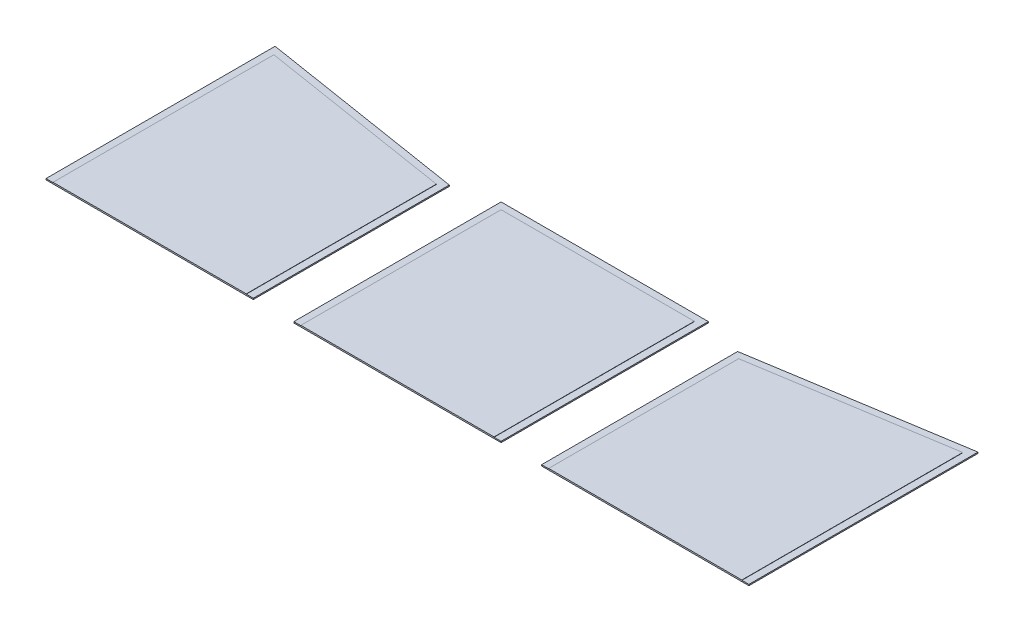
ISO-10303-21;
HEADER;
FILE_DESCRIPTION(('STEP AP214'),'2;1');
FILE_NAME('part.step','',(''),(''),'','','');
FILE_SCHEMA(('AUTOMOTIVE_DESIGN { 1 0 10303 214 1 1 1 1 }'));
ENDSEC;
DATA;
#1=APPLICATION_CONTEXT('core data for automotive mechanical design processes');
#2=APPLICATION_PROTOCOL_DEFINITION('international standard','automotive_design',2000,#1);
#3=PRODUCT_CONTEXT('',#1,'mechanical');
#4=PRODUCT('Part','Part','',(#3));
#5=PRODUCT_RELATED_PRODUCT_CATEGORY('part','',(#4));
#6=PRODUCT_DEFINITION_FORMATION('','',#4);
#7=PRODUCT_DEFINITION_CONTEXT('part definition',#1,'design');
#8=PRODUCT_DEFINITION('design','',#6,#7);
#9=PRODUCT_DEFINITION_SHAPE('','',#8);
#10=(LENGTH_UNIT() NAMED_UNIT(*) SI_UNIT(.MILLI.,.METRE.));
#11=(NAMED_UNIT(*) PLANE_ANGLE_UNIT() SI_UNIT($,.RADIAN.));
#12=(NAMED_UNIT(*) SI_UNIT($,.STERADIAN.) SOLID_ANGLE_UNIT());
#13=UNCERTAINTY_MEASURE_WITH_UNIT(LENGTH_MEASURE(1.E-05),#10,'distance_accuracy_value','');
#14=(GEOMETRIC_REPRESENTATION_CONTEXT(3) GLOBAL_UNCERTAINTY_ASSIGNED_CONTEXT((#13)) GLOBAL_UNIT_ASSIGNED_CONTEXT((#10,
#11,#12)) REPRESENTATION_CONTEXT('',''));
#15=CARTESIAN_POINT('',(0.,0.,0.));
#16=DIRECTION('',(0.,0.,1.));
#17=DIRECTION('',(1.,0.,0.));
#18=AXIS2_PLACEMENT_3D('',#15,#16,#17);
#19=CARTESIAN_POINT('',(0.,0.9,0.));
#20=DIRECTION('',(0.,-1.,0.));
#21=DIRECTION('',(0.,0.,-1.));
#22=AXIS2_PLACEMENT_3D('',#19,#20,#21);
#23=PLANE('',#22);
#24=DIRECTION('',(0.,0.,1.));
#25=VECTOR('',#24,1.);
#26=CARTESIAN_POINT('',(111.95,0.9,76.75));
#27=LINE('',#26,#25);
#28=CARTESIAN_POINT('',(111.95,0.9,-63.9635031038431));
#29=VERTEX_POINT('',#28);
#30=CARTESIAN_POINT('',(111.95,0.9,76.75));
#31=VERTEX_POINT('',#30);
#32=EDGE_CURVE('E73',#29,#31,#27,.T.);
#33=ORIENTED_EDGE('',*,*,#32,.F.);
#34=DIRECTION('',(-0.987506103130121,0.,0.157580761137785));
#35=VECTOR('',#34,1.);
#36=CARTESIAN_POINT('',(111.95,0.9,-63.9635031038431));
#37=LINE('',#36,#35);
#38=CARTESIAN_POINT('',(255.056022484842,0.9,-86.799570521637));
#39=VERTEX_POINT('',#38);
#40=EDGE_CURVE('E119',#39,#29,#37,.T.);
#41=ORIENTED_EDGE('',*,*,#40,.F.);
#42=DIRECTION('',(3.68236268928145E-05,0.,-0.99999999932201));
#43=VECTOR('',#42,1.);
#44=CARTESIAN_POINT('',(255.056022484842,0.9,-86.799570521637));
#45=LINE('',#44,#43);
#46=CARTESIAN_POINT('',(255.049999996474,0.9,76.75));
#47=VERTEX_POINT('',#46);
#48=EDGE_CURVE('E79',#47,#39,#45,.T.);
#49=ORIENTED_EDGE('',*,*,#48,.F.);
#50=DIRECTION('',(1.,0.,0.));
#51=VECTOR('',#50,1.);
#52=CARTESIAN_POINT('',(106.75,0.9,76.75));
#53=LINE('',#52,#51);
#54=CARTESIAN_POINT('',(260.25,0.9,76.75));
#55=VERTEX_POINT('',#54);
#56=EDGE_CURVE('E180',#47,#55,#53,.T.);
#57=ORIENTED_EDGE('',*,*,#56,.T.);
#58=DIRECTION('',(3.68236268927542E-05,0.,-0.99999999932201));
#59=VECTOR('',#58,1.);
#60=CARTESIAN_POINT('',(260.25,0.9,76.75));
#61=LINE('',#60,#59);
#62=CARTESIAN_POINT('',(260.256246950957,0.9,-92.8951838149399));
#63=VERTEX_POINT('',#62);
#64=EDGE_CURVE('E59',#55,#63,#61,.T.);
#65=ORIENTED_EDGE('',*,*,#64,.T.);
#66=DIRECTION('',(-0.98750610313012,0.,0.157580761137785));
#67=VECTOR('',#66,1.);
#68=CARTESIAN_POINT('',(260.256246950957,0.9,-92.8951838149399));
#69=LINE('',#68,#67);
#70=CARTESIAN_POINT('',(106.75,0.9,-68.39950611));
#71=VERTEX_POINT('',#70);
#72=EDGE_CURVE('E194',#63,#71,#69,.T.);
#73=ORIENTED_EDGE('',*,*,#72,.T.);
#74=DIRECTION('',(0.,0.,1.));
#75=VECTOR('',#74,1.);
#76=CARTESIAN_POINT('',(106.75,0.9,-68.39950611));
#77=LINE('',#76,#75);
#78=CARTESIAN_POINT('',(106.75,0.9,76.75));
#79=VERTEX_POINT('',#78);
#80=EDGE_CURVE('E192',#71,#79,#77,.T.);
#81=ORIENTED_EDGE('',*,*,#80,.T.);
#82=EDGE_CURVE('E189',#79,#31,#53,.T.);
#83=ORIENTED_EDGE('',*,*,#82,.T.);
#84=EDGE_LOOP('',(#33,#41,#49,#57,#65,#73,#81,#83));
#85=FACE_BOUND('',#84,.T.);
#86=ADVANCED_FACE('F56',(#85),#23,.F.);
#87=CARTESIAN_POINT('',(260.25,0.9,76.75));
#88=DIRECTION('',(-0.99999999932201,0.,-3.68236268927542E-05));
#89=DIRECTION('',(-3.68236268927542E-05,0.,0.99999999932201));
#90=AXIS2_PLACEMENT_3D('',#87,#88,#89);
#91=PLANE('',#90);
#92=DIRECTION('',(3.68236268927542E-05,0.,-0.99999999932201));
#93=VECTOR('',#92,1.);
#94=CARTESIAN_POINT('',(260.25,0.,76.75));
#95=LINE('',#94,#93);
#96=CARTESIAN_POINT('',(260.25,0.,76.75));
#97=VERTEX_POINT('',#96);
#98=CARTESIAN_POINT('',(260.256246950957,0.,-92.8951838149399));
#99=VERTEX_POINT('',#98);
#100=EDGE_CURVE('E12',#97,#99,#95,.T.);
#101=ORIENTED_EDGE('',*,*,#100,.T.);
#102=DIRECTION('',(0.,-1.,0.));
#103=VECTOR('',#102,1.);
#104=CARTESIAN_POINT('',(260.256246950957,0.9,-92.8951838149399));
#105=LINE('',#104,#103);
#106=EDGE_CURVE('E135',#63,#99,#105,.T.);
#107=ORIENTED_EDGE('',*,*,#106,.F.);
#108=ORIENTED_EDGE('',*,*,#64,.F.);
#109=DIRECTION('',(0.,-1.,0.));
#110=VECTOR('',#109,1.);
#111=CARTESIAN_POINT('',(260.25,0.9,76.75));
#112=LINE('',#111,#110);
#113=EDGE_CURVE('E176',#55,#97,#112,.T.);
#114=ORIENTED_EDGE('',*,*,#113,.T.);
#115=EDGE_LOOP('',(#101,#107,#108,#114));
#116=FACE_BOUND('',#115,.T.);
#117=ADVANCED_FACE('F203',(#116),#91,.F.);
#118=CARTESIAN_POINT('',(260.256246950957,0.9,-92.8951838149399));
#119=DIRECTION('',(0.157580761137785,0.,0.987506103130121));
#120=DIRECTION('',(0.987506103130121,0.,-0.157580761137785));
#121=AXIS2_PLACEMENT_3D('',#118,#119,#120);
#122=PLANE('',#121);
#123=DIRECTION('',(-0.98750610313012,0.,0.157580761137785));
#124=VECTOR('',#123,1.);
#125=CARTESIAN_POINT('',(260.256246950957,0.,-92.8951838149399));
#126=LINE('',#125,#124);
#127=CARTESIAN_POINT('',(106.75,0.,-68.39950611));
#128=VERTEX_POINT('',#127);
#129=EDGE_CURVE('E65',#99,#128,#126,.T.);
#130=ORIENTED_EDGE('',*,*,#129,.T.);
#131=DIRECTION('',(0.,-1.,0.));
#132=VECTOR('',#131,1.);
#133=CARTESIAN_POINT('',(106.75,0.9,-68.39950611));
#134=LINE('',#133,#132);
#135=EDGE_CURVE('E168',#71,#128,#134,.T.);
#136=ORIENTED_EDGE('',*,*,#135,.F.);
#137=ORIENTED_EDGE('',*,*,#72,.F.);
#138=ORIENTED_EDGE('',*,*,#106,.T.);
#139=EDGE_LOOP('',(#130,#136,#137,#138));
#140=FACE_BOUND('',#139,.T.);
#141=ADVANCED_FACE('F206',(#140),#122,.F.);
#142=CARTESIAN_POINT('',(106.75,0.9,-68.39950611));
#143=DIRECTION('',(1.,0.,0.));
#144=DIRECTION('',(0.,0.,-1.));
#145=AXIS2_PLACEMENT_3D('',#142,#143,#144);
#146=PLANE('',#145);
#147=DIRECTION('',(0.,0.,1.));
#148=VECTOR('',#147,1.);
#149=CARTESIAN_POINT('',(106.75,0.,-68.39950611));
#150=LINE('',#149,#148);
#151=CARTESIAN_POINT('',(106.75,0.,76.75));
#152=VERTEX_POINT('',#151);
#153=EDGE_CURVE('E184',#128,#152,#150,.T.);
#154=ORIENTED_EDGE('',*,*,#153,.T.);
#155=DIRECTION('',(0.,-1.,0.));
#156=VECTOR('',#155,1.);
#157=CARTESIAN_POINT('',(106.75,0.9,76.75));
#158=LINE('',#157,#156);
#159=EDGE_CURVE('E172',#79,#152,#158,.T.);
#160=ORIENTED_EDGE('',*,*,#159,.F.);
#161=ORIENTED_EDGE('',*,*,#80,.F.);
#162=ORIENTED_EDGE('',*,*,#135,.T.);
#163=EDGE_LOOP('',(#154,#160,#161,#162));
#164=FACE_BOUND('',#163,.T.);
#165=ADVANCED_FACE('F211',(#164),#146,.F.);
#166=CARTESIAN_POINT('',(106.75,0.9,76.75));
#167=DIRECTION('',(0.,0.,-1.));
#168=DIRECTION('',(-1.,0.,0.));
#169=AXIS2_PLACEMENT_3D('',#166,#167,#168);
#170=PLANE('',#169);
#171=DIRECTION('',(1.,0.,0.));
#172=VECTOR('',#171,1.);
#173=CARTESIAN_POINT('',(106.75,0.,76.75));
#174=LINE('',#173,#172);
#175=EDGE_CURVE('E181',#152,#97,#174,.T.);
#176=ORIENTED_EDGE('',*,*,#175,.T.);
#177=ORIENTED_EDGE('',*,*,#113,.F.);
#178=ORIENTED_EDGE('',*,*,#56,.F.);
#179=DIRECTION('',(0.,-1.,0.));
#180=VECTOR('',#179,1.);
#181=CARTESIAN_POINT('',(255.049999996474,1.1,76.75));
#182=LINE('',#181,#180);
#183=CARTESIAN_POINT('',(255.049999996474,1.1,76.75));
#184=VERTEX_POINT('',#183);
#185=EDGE_CURVE('E133',#184,#47,#182,.T.);
#186=ORIENTED_EDGE('',*,*,#185,.F.);
#187=DIRECTION('',(1.,0.,0.));
#188=VECTOR('',#187,1.);
#189=CARTESIAN_POINT('',(255.049999996474,1.1,76.75));
#190=LINE('',#189,#188);
#191=CARTESIAN_POINT('',(111.95,1.1,76.75));
#192=VERTEX_POINT('',#191);
#193=EDGE_CURVE('E153',#192,#184,#190,.T.);
#194=ORIENTED_EDGE('',*,*,#193,.F.);
#195=DIRECTION('',(0.,-1.,0.));
#196=VECTOR('',#195,1.);
#197=CARTESIAN_POINT('',(111.95,1.1,76.75));
#198=LINE('',#197,#196);
#199=EDGE_CURVE('E144',#192,#31,#198,.T.);
#200=ORIENTED_EDGE('',*,*,#199,.T.);
#201=ORIENTED_EDGE('',*,*,#82,.F.);
#202=ORIENTED_EDGE('',*,*,#159,.T.);
#203=EDGE_LOOP('',(#176,#177,#178,#186,#194,#200,#201,#202));
#204=FACE_BOUND('',#203,.T.);
#205=ADVANCED_FACE('F219',(#204),#170,.F.);
#206=CARTESIAN_POINT('',(0.,0.,0.));
#207=DIRECTION('',(0.,-1.,0.));
#208=DIRECTION('',(0.,0.,-1.));
#209=AXIS2_PLACEMENT_3D('',#206,#207,#208);
#210=PLANE('',#209);
#211=ORIENTED_EDGE('',*,*,#100,.F.);
#212=ORIENTED_EDGE('',*,*,#175,.F.);
#213=ORIENTED_EDGE('',*,*,#153,.F.);
#214=ORIENTED_EDGE('',*,*,#129,.F.);
#215=EDGE_LOOP('',(#211,#212,#213,#214));
#216=FACE_BOUND('',#215,.T.);
#217=ADVANCED_FACE('F242',(#216),#210,.T.);
#218=CARTESIAN_POINT('',(255.056022484842,1.1,-86.799570521637));
#219=DIRECTION('',(-0.99999999932201,0.,-3.68236268928145E-05));
#220=DIRECTION('',(-3.68236268928145E-05,0.,0.99999999932201));
#221=AXIS2_PLACEMENT_3D('',#218,#219,#220);
#222=PLANE('',#221);
#223=ORIENTED_EDGE('',*,*,#48,.T.);
#224=DIRECTION('',(0.,-1.,0.));
#225=VECTOR('',#224,1.);
#226=CARTESIAN_POINT('',(255.056022484842,1.1,-86.799570521637));
#227=LINE('',#226,#225);
#228=CARTESIAN_POINT('',(255.056022484842,1.1,-86.799570521637));
#229=VERTEX_POINT('',#228);
#230=EDGE_CURVE('E130',#229,#39,#227,.T.);
#231=ORIENTED_EDGE('',*,*,#230,.F.);
#232=DIRECTION('',(3.68236268928145E-05,0.,-0.99999999932201));
#233=VECTOR('',#232,1.);
#234=CARTESIAN_POINT('',(255.056022484842,1.1,-86.799570521637));
#235=LINE('',#234,#233);
#236=EDGE_CURVE('E159',#184,#229,#235,.T.);
#237=ORIENTED_EDGE('',*,*,#236,.F.);
#238=ORIENTED_EDGE('',*,*,#185,.T.);
#239=EDGE_LOOP('',(#223,#231,#237,#238));
#240=FACE_BOUND('',#239,.T.);
#241=ADVANCED_FACE('F129',(#240),#222,.F.);
#242=CARTESIAN_POINT('',(111.95,1.1,-63.9635031038431));
#243=DIRECTION('',(0.157580761137785,0.,0.987506103130121));
#244=DIRECTION('',(0.987506103130121,0.,-0.157580761137785));
#245=AXIS2_PLACEMENT_3D('',#242,#243,#244);
#246=PLANE('',#245);
#247=ORIENTED_EDGE('',*,*,#40,.T.);
#248=DIRECTION('',(0.,-1.,0.));
#249=VECTOR('',#248,1.);
#250=CARTESIAN_POINT('',(111.95,1.1,-63.9635031038431));
#251=LINE('',#250,#249);
#252=CARTESIAN_POINT('',(111.95,1.1,-63.9635031038431));
#253=VERTEX_POINT('',#252);
#254=EDGE_CURVE('E140',#253,#29,#251,.T.);
#255=ORIENTED_EDGE('',*,*,#254,.F.);
#256=DIRECTION('',(-0.987506103130121,0.,0.157580761137785));
#257=VECTOR('',#256,1.);
#258=CARTESIAN_POINT('',(111.95,1.1,-63.9635031038431));
#259=LINE('',#258,#257);
#260=EDGE_CURVE('E138',#229,#253,#259,.T.);
#261=ORIENTED_EDGE('',*,*,#260,.F.);
#262=ORIENTED_EDGE('',*,*,#230,.T.);
#263=EDGE_LOOP('',(#247,#255,#261,#262));
#264=FACE_BOUND('',#263,.T.);
#265=ADVANCED_FACE('F137',(#264),#246,.F.);
#266=CARTESIAN_POINT('',(111.95,1.1,76.75));
#267=DIRECTION('',(1.,0.,0.));
#268=DIRECTION('',(0.,0.,-1.));
#269=AXIS2_PLACEMENT_3D('',#266,#267,#268);
#270=PLANE('',#269);
#271=ORIENTED_EDGE('',*,*,#32,.T.);
#272=ORIENTED_EDGE('',*,*,#199,.F.);
#273=DIRECTION('',(0.,0.,1.));
#274=VECTOR('',#273,1.);
#275=CARTESIAN_POINT('',(111.95,1.1,76.75));
#276=LINE('',#275,#274);
#277=EDGE_CURVE('E151',#253,#192,#276,.T.);
#278=ORIENTED_EDGE('',*,*,#277,.F.);
#279=ORIENTED_EDGE('',*,*,#254,.T.);
#280=EDGE_LOOP('',(#271,#272,#278,#279));
#281=FACE_BOUND('',#280,.T.);
#282=ADVANCED_FACE('F216',(#281),#270,.F.);
#283=CARTESIAN_POINT('',(0.,1.1,0.));
#284=DIRECTION('',(0.,-1.,0.));
#285=DIRECTION('',(0.,0.,-1.));
#286=AXIS2_PLACEMENT_3D('',#283,#284,#285);
#287=PLANE('',#286);
#288=ORIENTED_EDGE('',*,*,#193,.T.);
#289=ORIENTED_EDGE('',*,*,#236,.T.);
#290=ORIENTED_EDGE('',*,*,#260,.T.);
#291=ORIENTED_EDGE('',*,*,#277,.T.);
#292=EDGE_LOOP('',(#288,#289,#290,#291));
#293=FACE_BOUND('',#292,.T.);
#294=ADVANCED_FACE('F221',(#293),#287,.F.);
#295=CLOSED_SHELL('',(#86,#117,#141,#165,#205,#217,#241,#265,#282,#294));
#296=MANIFOLD_SOLID_BREP('B2',#295);
#297=CARTESIAN_POINT('',(0.,0.9,0.));
#298=DIRECTION('',(0.,-1.,0.));
#299=DIRECTION('',(0.,0.,-1.));
#300=AXIS2_PLACEMENT_3D('',#297,#298,#299);
#301=PLANE('',#300);
#302=DIRECTION('',(3.68236268928146E-05,0.,0.99999999932201));
#303=VECTOR('',#302,1.);
#304=CARTESIAN_POINT('',(-255.056022484842,0.9,-86.7995705216369));
#305=LINE('',#304,#303);
#306=CARTESIAN_POINT('',(-255.056022484842,0.9,-86.7995705216369));
#307=VERTEX_POINT('',#306);
#308=CARTESIAN_POINT('',(-255.049999996474,0.9,76.75));
#309=VERTEX_POINT('',#308);
#310=EDGE_CURVE('E335',#307,#309,#305,.T.);
#311=ORIENTED_EDGE('',*,*,#310,.F.);
#312=DIRECTION('',(-0.987506103130121,0.,-0.157580761137785));
#313=VECTOR('',#312,1.);
#314=CARTESIAN_POINT('',(-111.95,0.9,-63.9635031038431));
#315=LINE('',#314,#313);
#316=CARTESIAN_POINT('',(-111.95,0.9,-63.9635031038431));
#317=VERTEX_POINT('',#316);
#318=EDGE_CURVE('E381',#317,#307,#315,.T.);
#319=ORIENTED_EDGE('',*,*,#318,.F.);
#320=DIRECTION('',(0.,0.,-1.));
#321=VECTOR('',#320,1.);
#322=CARTESIAN_POINT('',(-111.95,0.9,76.75));
#323=LINE('',#322,#321);
#324=CARTESIAN_POINT('',(-111.95,0.9,76.75));
#325=VERTEX_POINT('',#324);
#326=EDGE_CURVE('E341',#325,#317,#323,.T.);
#327=ORIENTED_EDGE('',*,*,#326,.F.);
#328=DIRECTION('',(1.,0.,0.));
#329=VECTOR('',#328,1.);
#330=CARTESIAN_POINT('',(-260.25,0.9,76.75));
#331=LINE('',#330,#329);
#332=CARTESIAN_POINT('',(-106.75,0.9,76.75));
#333=VERTEX_POINT('',#332);
#334=EDGE_CURVE('E434',#325,#333,#331,.T.);
#335=ORIENTED_EDGE('',*,*,#334,.T.);
#336=DIRECTION('',(0.,0.,-1.));
#337=VECTOR('',#336,1.);
#338=CARTESIAN_POINT('',(-106.75,0.9,76.75));
#339=LINE('',#338,#337);
#340=CARTESIAN_POINT('',(-106.75,0.9,-68.39950611));
#341=VERTEX_POINT('',#340);
#342=EDGE_CURVE('E427',#333,#341,#339,.T.);
#343=ORIENTED_EDGE('',*,*,#342,.T.);
#344=DIRECTION('',(-0.987506103130121,0.,-0.157580761137785));
#345=VECTOR('',#344,1.);
#346=CARTESIAN_POINT('',(-106.75,0.9,-68.39950611));
#347=LINE('',#346,#345);
#348=CARTESIAN_POINT('',(-260.256246950957,0.9,-92.8951838149399));
#349=VERTEX_POINT('',#348);
#350=EDGE_CURVE('E322',#341,#349,#347,.T.);
#351=ORIENTED_EDGE('',*,*,#350,.T.);
#352=DIRECTION('',(3.68236268927542E-05,0.,0.99999999932201));
#353=VECTOR('',#352,1.);
#354=CARTESIAN_POINT('',(-260.256246950957,0.9,-92.8951838149399));
#355=LINE('',#354,#353);
#356=CARTESIAN_POINT('',(-260.25,0.9,76.75));
#357=VERTEX_POINT('',#356);
#358=EDGE_CURVE('E436',#349,#357,#355,.T.);
#359=ORIENTED_EDGE('',*,*,#358,.T.);
#360=EDGE_CURVE('E435',#357,#309,#331,.T.);
#361=ORIENTED_EDGE('',*,*,#360,.T.);
#362=EDGE_LOOP('',(#311,#319,#327,#335,#343,#351,#359,#361));
#363=FACE_BOUND('',#362,.T.);
#364=ADVANCED_FACE('F319',(#363),#301,.F.);
#365=CARTESIAN_POINT('',(-106.75,0.9,-68.39950611));
#366=DIRECTION('',(-0.157580761137785,0.,0.987506103130121));
#367=DIRECTION('',(0.987506103130121,0.,0.157580761137785));
#368=AXIS2_PLACEMENT_3D('',#365,#366,#367);
#369=PLANE('',#368);
#370=DIRECTION('',(-0.987506103130121,0.,-0.157580761137785));
#371=VECTOR('',#370,1.);
#372=CARTESIAN_POINT('',(-106.75,0.,-68.39950611));
#373=LINE('',#372,#371);
#374=CARTESIAN_POINT('',(-106.75,0.,-68.39950611));
#375=VERTEX_POINT('',#374);
#376=CARTESIAN_POINT('',(-260.256246950957,0.,-92.8951838149399));
#377=VERTEX_POINT('',#376);
#378=EDGE_CURVE('E54',#375,#377,#373,.T.);
#379=ORIENTED_EDGE('',*,*,#378,.T.);
#380=DIRECTION('',(0.,-1.,0.));
#381=VECTOR('',#380,1.);
#382=CARTESIAN_POINT('',(-260.256246950957,0.9,-92.8951838149399));
#383=LINE('',#382,#381);
#384=EDGE_CURVE('E395',#349,#377,#383,.T.);
#385=ORIENTED_EDGE('',*,*,#384,.F.);
#386=ORIENTED_EDGE('',*,*,#350,.F.);
#387=DIRECTION('',(0.,-1.,0.));
#388=VECTOR('',#387,1.);
#389=CARTESIAN_POINT('',(-106.75,0.9,-68.39950611));
#390=LINE('',#389,#388);
#391=EDGE_CURVE('E424',#341,#375,#390,.T.);
#392=ORIENTED_EDGE('',*,*,#391,.T.);
#393=EDGE_LOOP('',(#379,#385,#386,#392));
#394=FACE_BOUND('',#393,.T.);
#395=ADVANCED_FACE('F444',(#394),#369,.F.);
#396=CARTESIAN_POINT('',(-260.256246950957,0.9,-92.8951838149399));
#397=DIRECTION('',(0.99999999932201,0.,-3.68236268927542E-05));
#398=DIRECTION('',(-3.68236268927542E-05,0.,-0.99999999932201));
#399=AXIS2_PLACEMENT_3D('',#396,#397,#398);
#400=PLANE('',#399);
#401=DIRECTION('',(3.68236268927542E-05,0.,0.99999999932201));
#402=VECTOR('',#401,1.);
#403=CARTESIAN_POINT('',(-260.256246950957,0.,-92.8951838149399));
#404=LINE('',#403,#402);
#405=CARTESIAN_POINT('',(-260.25,0.,76.75));
#406=VERTEX_POINT('',#405);
#407=EDGE_CURVE('E327',#377,#406,#404,.T.);
#408=ORIENTED_EDGE('',*,*,#407,.T.);
#409=DIRECTION('',(0.,-1.,0.));
#410=VECTOR('',#409,1.);
#411=CARTESIAN_POINT('',(-260.25,0.9,76.75));
#412=LINE('',#411,#410);
#413=EDGE_CURVE('E418',#357,#406,#412,.T.);
#414=ORIENTED_EDGE('',*,*,#413,.F.);
#415=ORIENTED_EDGE('',*,*,#358,.F.);
#416=ORIENTED_EDGE('',*,*,#384,.T.);
#417=EDGE_LOOP('',(#408,#414,#415,#416));
#418=FACE_BOUND('',#417,.T.);
#419=ADVANCED_FACE('F447',(#418),#400,.F.);
#420=CARTESIAN_POINT('',(-260.25,0.9,76.75));
#421=DIRECTION('',(0.,0.,-1.));
#422=DIRECTION('',(-1.,0.,0.));
#423=AXIS2_PLACEMENT_3D('',#420,#421,#422);
#424=PLANE('',#423);
#425=DIRECTION('',(1.,0.,0.));
#426=VECTOR('',#425,1.);
#427=CARTESIAN_POINT('',(-260.25,0.,76.75));
#428=LINE('',#427,#426);
#429=CARTESIAN_POINT('',(-106.75,0.,76.75));
#430=VERTEX_POINT('',#429);
#431=EDGE_CURVE('E430',#406,#430,#428,.T.);
#432=ORIENTED_EDGE('',*,*,#431,.T.);
#433=DIRECTION('',(0.,-1.,0.));
#434=VECTOR('',#433,1.);
#435=CARTESIAN_POINT('',(-106.75,0.9,76.75));
#436=LINE('',#435,#434);
#437=EDGE_CURVE('E421',#333,#430,#436,.T.);
#438=ORIENTED_EDGE('',*,*,#437,.F.);
#439=ORIENTED_EDGE('',*,*,#334,.F.);
#440=DIRECTION('',(0.,-1.,0.));
#441=VECTOR('',#440,1.);
#442=CARTESIAN_POINT('',(-111.95,1.1,76.75));
#443=LINE('',#442,#441);
#444=CARTESIAN_POINT('',(-111.95,1.1,76.75));
#445=VERTEX_POINT('',#444);
#446=EDGE_CURVE('E394',#445,#325,#443,.T.);
#447=ORIENTED_EDGE('',*,*,#446,.F.);
#448=DIRECTION('',(1.,0.,0.));
#449=VECTOR('',#448,1.);
#450=CARTESIAN_POINT('',(-255.049999996474,1.1,76.75));
#451=LINE('',#450,#449);
#452=CARTESIAN_POINT('',(-255.049999996474,1.1,76.75));
#453=VERTEX_POINT('',#452);
#454=EDGE_CURVE('E408',#453,#445,#451,.T.);
#455=ORIENTED_EDGE('',*,*,#454,.F.);
#456=DIRECTION('',(0.,-1.,0.));
#457=VECTOR('',#456,1.);
#458=CARTESIAN_POINT('',(-255.049999996474,1.1,76.75));
#459=LINE('',#458,#457);
#460=EDGE_CURVE('E401',#453,#309,#459,.T.);
#461=ORIENTED_EDGE('',*,*,#460,.T.);
#462=ORIENTED_EDGE('',*,*,#360,.F.);
#463=ORIENTED_EDGE('',*,*,#413,.T.);
#464=EDGE_LOOP('',(#432,#438,#439,#447,#455,#461,#462,#463));
#465=FACE_BOUND('',#464,.T.);
#466=ADVANCED_FACE('F451',(#465),#424,.F.);
#467=CARTESIAN_POINT('',(-106.75,0.9,76.75));
#468=DIRECTION('',(-1.,0.,0.));
#469=DIRECTION('',(0.,0.,1.));
#470=AXIS2_PLACEMENT_3D('',#467,#468,#469);
#471=PLANE('',#470);
#472=DIRECTION('',(0.,0.,-1.));
#473=VECTOR('',#472,1.);
#474=CARTESIAN_POINT('',(-106.75,0.,76.75));
#475=LINE('',#474,#473);
#476=EDGE_CURVE('E428',#430,#375,#475,.T.);
#477=ORIENTED_EDGE('',*,*,#476,.T.);
#478=ORIENTED_EDGE('',*,*,#391,.F.);
#479=ORIENTED_EDGE('',*,*,#342,.F.);
#480=ORIENTED_EDGE('',*,*,#437,.T.);
#481=EDGE_LOOP('',(#477,#478,#479,#480));
#482=FACE_BOUND('',#481,.T.);
#483=ADVANCED_FACE('F462',(#482),#471,.F.);
#484=CARTESIAN_POINT('',(0.,0.,0.));
#485=DIRECTION('',(0.,-1.,0.));
#486=DIRECTION('',(0.,0.,-1.));
#487=AXIS2_PLACEMENT_3D('',#484,#485,#486);
#488=PLANE('',#487);
#489=ORIENTED_EDGE('',*,*,#378,.F.);
#490=ORIENTED_EDGE('',*,*,#476,.F.);
#491=ORIENTED_EDGE('',*,*,#431,.F.);
#492=ORIENTED_EDGE('',*,*,#407,.F.);
#493=EDGE_LOOP('',(#489,#490,#491,#492));
#494=FACE_BOUND('',#493,.T.);
#495=ADVANCED_FACE('F464',(#494),#488,.T.);
#496=CARTESIAN_POINT('',(-111.95,1.1,76.75));
#497=DIRECTION('',(-1.,0.,0.));
#498=DIRECTION('',(0.,0.,1.));
#499=AXIS2_PLACEMENT_3D('',#496,#497,#498);
#500=PLANE('',#499);
#501=ORIENTED_EDGE('',*,*,#326,.T.);
#502=DIRECTION('',(0.,-1.,0.));
#503=VECTOR('',#502,1.);
#504=CARTESIAN_POINT('',(-111.95,1.1,-63.9635031038431));
#505=LINE('',#504,#503);
#506=CARTESIAN_POINT('',(-111.95,1.1,-63.9635031038431));
#507=VERTEX_POINT('',#506);
#508=EDGE_CURVE('E391',#507,#317,#505,.T.);
#509=ORIENTED_EDGE('',*,*,#508,.F.);
#510=DIRECTION('',(0.,0.,-1.));
#511=VECTOR('',#510,1.);
#512=CARTESIAN_POINT('',(-111.95,1.1,76.75));
#513=LINE('',#512,#511);
#514=EDGE_CURVE('E412',#445,#507,#513,.T.);
#515=ORIENTED_EDGE('',*,*,#514,.F.);
#516=ORIENTED_EDGE('',*,*,#446,.T.);
#517=EDGE_LOOP('',(#501,#509,#515,#516));
#518=FACE_BOUND('',#517,.T.);
#519=ADVANCED_FACE('F390',(#518),#500,.F.);
#520=CARTESIAN_POINT('',(-111.95,1.1,-63.9635031038431));
#521=DIRECTION('',(-0.157580761137785,0.,0.987506103130121));
#522=DIRECTION('',(0.987506103130121,0.,0.157580761137785));
#523=AXIS2_PLACEMENT_3D('',#520,#521,#522);
#524=PLANE('',#523);
#525=ORIENTED_EDGE('',*,*,#318,.T.);
#526=DIRECTION('',(0.,-1.,0.));
#527=VECTOR('',#526,1.);
#528=CARTESIAN_POINT('',(-255.056022484842,1.1,-86.7995705216369));
#529=LINE('',#528,#527);
#530=CARTESIAN_POINT('',(-255.056022484842,1.1,-86.7995705216369));
#531=VERTEX_POINT('',#530);
#532=EDGE_CURVE('E399',#531,#307,#529,.T.);
#533=ORIENTED_EDGE('',*,*,#532,.F.);
#534=DIRECTION('',(-0.987506103130121,0.,-0.157580761137785));
#535=VECTOR('',#534,1.);
#536=CARTESIAN_POINT('',(-111.95,1.1,-63.9635031038431));
#537=LINE('',#536,#535);
#538=EDGE_CURVE('E398',#507,#531,#537,.T.);
#539=ORIENTED_EDGE('',*,*,#538,.F.);
#540=ORIENTED_EDGE('',*,*,#508,.T.);
#541=EDGE_LOOP('',(#525,#533,#539,#540));
#542=FACE_BOUND('',#541,.T.);
#543=ADVANCED_FACE('F397',(#542),#524,.F.);
#544=CARTESIAN_POINT('',(-255.056022484842,1.1,-86.7995705216369));
#545=DIRECTION('',(0.99999999932201,0.,-3.68236268928146E-05));
#546=DIRECTION('',(-3.68236268928146E-05,0.,-0.99999999932201));
#547=AXIS2_PLACEMENT_3D('',#544,#545,#546);
#548=PLANE('',#547);
#549=ORIENTED_EDGE('',*,*,#310,.T.);
#550=ORIENTED_EDGE('',*,*,#460,.F.);
#551=DIRECTION('',(3.68236268928146E-05,0.,0.99999999932201));
#552=VECTOR('',#551,1.);
#553=CARTESIAN_POINT('',(-255.056022484842,1.1,-86.7995705216369));
#554=LINE('',#553,#552);
#555=EDGE_CURVE('E407',#531,#453,#554,.T.);
#556=ORIENTED_EDGE('',*,*,#555,.F.);
#557=ORIENTED_EDGE('',*,*,#532,.T.);
#558=EDGE_LOOP('',(#549,#550,#556,#557));
#559=FACE_BOUND('',#558,.T.);
#560=ADVANCED_FACE('F455',(#559),#548,.F.);
#561=CARTESIAN_POINT('',(0.,1.1,0.));
#562=DIRECTION('',(0.,1.,0.));
#563=DIRECTION('',(0.,0.,1.));
#564=AXIS2_PLACEMENT_3D('',#561,#562,#563);
#565=PLANE('',#564);
#566=ORIENTED_EDGE('',*,*,#454,.T.);
#567=ORIENTED_EDGE('',*,*,#514,.T.);
#568=ORIENTED_EDGE('',*,*,#538,.T.);
#569=ORIENTED_EDGE('',*,*,#555,.T.);
#570=EDGE_LOOP('',(#566,#567,#568,#569));
#571=FACE_BOUND('',#570,.T.);
#572=ADVANCED_FACE('F458',(#571),#565,.T.);
#573=CLOSED_SHELL('',(#364,#395,#419,#466,#483,#495,#519,#543,#560,#572));
#574=MANIFOLD_SOLID_BREP('B6',#573);
#575=CARTESIAN_POINT('',(76.75,0.9,-76.75));
#576=DIRECTION('',(0.,0.,1.));
#577=DIRECTION('',(1.,0.,0.));
#578=AXIS2_PLACEMENT_3D('',#575,#576,#577);
#579=PLANE('',#578);
#580=DIRECTION('',(-1.,0.,0.));
#581=VECTOR('',#580,1.);
#582=CARTESIAN_POINT('',(76.75,0.,-76.75));
#583=LINE('',#582,#581);
#584=CARTESIAN_POINT('',(76.75,0.,-76.75));
#585=VERTEX_POINT('',#584);
#586=CARTESIAN_POINT('',(-76.75,0.,-76.75));
#587=VERTEX_POINT('',#586);
#588=EDGE_CURVE('E635',#585,#587,#583,.T.);
#589=ORIENTED_EDGE('',*,*,#588,.T.);
#590=DIRECTION('',(0.,-1.,0.));
#591=VECTOR('',#590,1.);
#592=CARTESIAN_POINT('',(-76.75,0.9,-76.75));
#593=LINE('',#592,#591);
#594=CARTESIAN_POINT('',(-76.75,0.9,-76.75));
#595=VERTEX_POINT('',#594);
#596=EDGE_CURVE('E317',#595,#587,#593,.T.);
#597=ORIENTED_EDGE('',*,*,#596,.F.);
#598=DIRECTION('',(-1.,0.,0.));
#599=VECTOR('',#598,1.);
#600=CARTESIAN_POINT('',(76.75,0.9,-76.75));
#601=LINE('',#600,#599);
#602=CARTESIAN_POINT('',(76.75,0.9,-76.75));
#603=VERTEX_POINT('',#602);
#604=EDGE_CURVE('E644',#603,#595,#601,.T.);
#605=ORIENTED_EDGE('',*,*,#604,.F.);
#606=DIRECTION('',(0.,-1.,0.));
#607=VECTOR('',#606,1.);
#608=CARTESIAN_POINT('',(76.75,0.9,-76.75));
#609=LINE('',#608,#607);
#610=EDGE_CURVE('E653',#603,#585,#609,.T.);
#611=ORIENTED_EDGE('',*,*,#610,.T.);
#612=EDGE_LOOP('',(#589,#597,#605,#611));
#613=FACE_BOUND('',#612,.T.);
#614=ADVANCED_FACE('F549',(#613),#579,.F.);
#615=CARTESIAN_POINT('',(-76.75,0.9,-76.75));
#616=DIRECTION('',(1.,0.,0.));
#617=DIRECTION('',(0.,0.,-1.));
#618=AXIS2_PLACEMENT_3D('',#615,#616,#617);
#619=PLANE('',#618);
#620=DIRECTION('',(0.,0.,1.));
#621=VECTOR('',#620,1.);
#622=CARTESIAN_POINT('',(-76.75,0.,-76.75));
#623=LINE('',#622,#621);
#624=CARTESIAN_POINT('',(-76.75,0.,76.75));
#625=VERTEX_POINT('',#624);
#626=EDGE_CURVE('E638',#587,#625,#623,.T.);
#627=ORIENTED_EDGE('',*,*,#626,.T.);
#628=DIRECTION('',(0.,-1.,0.));
#629=VECTOR('',#628,1.);
#630=CARTESIAN_POINT('',(-76.75,0.9,76.75));
#631=LINE('',#630,#629);
#632=CARTESIAN_POINT('',(-76.75,0.9,76.75));
#633=VERTEX_POINT('',#632);
#634=EDGE_CURVE('E556',#633,#625,#631,.T.);
#635=ORIENTED_EDGE('',*,*,#634,.F.);
#636=DIRECTION('',(0.,0.,1.));
#637=VECTOR('',#636,1.);
#638=CARTESIAN_POINT('',(-76.75,0.9,-76.75));
#639=LINE('',#638,#637);
#640=EDGE_CURVE('E647',#595,#633,#639,.T.);
#641=ORIENTED_EDGE('',*,*,#640,.F.);
#642=ORIENTED_EDGE('',*,*,#596,.T.);
#643=EDGE_LOOP('',(#627,#635,#641,#642));
#644=FACE_BOUND('',#643,.T.);
#645=ADVANCED_FACE('F680',(#644),#619,.F.);
#646=CARTESIAN_POINT('',(-76.75,0.9,76.75));
#647=DIRECTION('',(0.,0.,-1.));
#648=DIRECTION('',(-1.,0.,0.));
#649=AXIS2_PLACEMENT_3D('',#646,#647,#648);
#650=PLANE('',#649);
#651=DIRECTION('',(1.,0.,0.));
#652=VECTOR('',#651,1.);
#653=CARTESIAN_POINT('',(-76.75,0.,76.75));
#654=LINE('',#653,#652);
#655=CARTESIAN_POINT('',(76.75,0.,76.75));
#656=VERTEX_POINT('',#655);
#657=EDGE_CURVE('E656',#625,#656,#654,.T.);
#658=ORIENTED_EDGE('',*,*,#657,.T.);
#659=DIRECTION('',(0.,-1.,0.));
#660=VECTOR('',#659,1.);
#661=CARTESIAN_POINT('',(76.75,0.9,76.75));
#662=LINE('',#661,#660);
#663=CARTESIAN_POINT('',(76.75,0.9,76.75));
#664=VERTEX_POINT('',#663);
#665=EDGE_CURVE('E661',#664,#656,#662,.T.);
#666=ORIENTED_EDGE('',*,*,#665,.F.);
#667=DIRECTION('',(1.,0.,0.));
#668=VECTOR('',#667,1.);
#669=CARTESIAN_POINT('',(-76.75,0.9,76.75));
#670=LINE('',#669,#668);
#671=CARTESIAN_POINT('',(71.55,0.9,76.75));
#672=VERTEX_POINT('',#671);
#673=EDGE_CURVE('E634',#672,#664,#670,.T.);
#674=ORIENTED_EDGE('',*,*,#673,.F.);
#675=DIRECTION('',(0.,-1.,0.));
#676=VECTOR('',#675,1.);
#677=CARTESIAN_POINT('',(71.55,1.1,76.75));
#678=LINE('',#677,#676);
#679=CARTESIAN_POINT('',(71.55,1.1,76.75));
#680=VERTEX_POINT('',#679);
#681=EDGE_CURVE('E616',#680,#672,#678,.T.);
#682=ORIENTED_EDGE('',*,*,#681,.F.);
#683=DIRECTION('',(1.,0.,0.));
#684=VECTOR('',#683,1.);
#685=CARTESIAN_POINT('',(71.55,1.1,76.75));
#686=LINE('',#685,#684);
#687=CARTESIAN_POINT('',(-71.55,1.1,76.75));
#688=VERTEX_POINT('',#687);
#689=EDGE_CURVE('E622',#688,#680,#686,.T.);
#690=ORIENTED_EDGE('',*,*,#689,.F.);
#691=DIRECTION('',(0.,-1.,0.));
#692=VECTOR('',#691,1.);
#693=CARTESIAN_POINT('',(-71.55,1.1,76.75));
#694=LINE('',#693,#692);
#695=CARTESIAN_POINT('',(-71.55,0.9,76.75));
#696=VERTEX_POINT('',#695);
#697=EDGE_CURVE('E767',#688,#696,#694,.T.);
#698=ORIENTED_EDGE('',*,*,#697,.T.);
#699=EDGE_CURVE('E650',#633,#696,#670,.T.);
#700=ORIENTED_EDGE('',*,*,#699,.F.);
#701=ORIENTED_EDGE('',*,*,#634,.T.);
#702=EDGE_LOOP('',(#658,#666,#674,#682,#690,#698,#700,#701));
#703=FACE_BOUND('',#702,.T.);
#704=ADVANCED_FACE('F632',(#703),#650,.F.);
#705=CARTESIAN_POINT('',(76.75,0.9,76.75));
#706=DIRECTION('',(-1.,0.,0.));
#707=DIRECTION('',(0.,0.,1.));
#708=AXIS2_PLACEMENT_3D('',#705,#706,#707);
#709=PLANE('',#708);
#710=DIRECTION('',(0.,0.,-1.));
#711=VECTOR('',#710,1.);
#712=CARTESIAN_POINT('',(76.75,0.,76.75));
#713=LINE('',#712,#711);
#714=EDGE_CURVE('E648',#656,#585,#713,.T.);
#715=ORIENTED_EDGE('',*,*,#714,.T.);
#716=ORIENTED_EDGE('',*,*,#610,.F.);
#717=DIRECTION('',(0.,0.,-1.));
#718=VECTOR('',#717,1.);
#719=CARTESIAN_POINT('',(76.75,0.9,76.75));
#720=LINE('',#719,#718);
#721=EDGE_CURVE('E652',#664,#603,#720,.T.);
#722=ORIENTED_EDGE('',*,*,#721,.F.);
#723=ORIENTED_EDGE('',*,*,#665,.T.);
#724=EDGE_LOOP('',(#715,#716,#722,#723));
#725=FACE_BOUND('',#724,.T.);
#726=ADVANCED_FACE('F674',(#725),#709,.F.);
#727=CARTESIAN_POINT('',(0.,0.9,0.));
#728=DIRECTION('',(0.,1.,0.));
#729=DIRECTION('',(0.,0.,1.));
#730=AXIS2_PLACEMENT_3D('',#727,#728,#729);
#731=PLANE('',#730);
#732=DIRECTION('',(0.,0.,1.));
#733=VECTOR('',#732,1.);
#734=CARTESIAN_POINT('',(-71.55,0.9,76.75));
#735=LINE('',#734,#733);
#736=CARTESIAN_POINT('',(-71.55,0.9,-71.55));
#737=VERTEX_POINT('',#736);
#738=EDGE_CURVE('E563',#737,#696,#735,.T.);
#739=ORIENTED_EDGE('',*,*,#738,.F.);
#740=DIRECTION('',(-1.,0.,0.));
#741=VECTOR('',#740,1.);
#742=CARTESIAN_POINT('',(-71.55,0.9,-71.55));
#743=LINE('',#742,#741);
#744=CARTESIAN_POINT('',(71.55,0.9,-71.55));
#745=VERTEX_POINT('',#744);
#746=EDGE_CURVE('E769',#745,#737,#743,.T.);
#747=ORIENTED_EDGE('',*,*,#746,.F.);
#748=DIRECTION('',(0.,0.,-1.));
#749=VECTOR('',#748,1.);
#750=CARTESIAN_POINT('',(71.55,0.9,-71.55));
#751=LINE('',#750,#749);
#752=EDGE_CURVE('E569',#672,#745,#751,.T.);
#753=ORIENTED_EDGE('',*,*,#752,.F.);
#754=ORIENTED_EDGE('',*,*,#673,.T.);
#755=ORIENTED_EDGE('',*,*,#721,.T.);
#756=ORIENTED_EDGE('',*,*,#604,.T.);
#757=ORIENTED_EDGE('',*,*,#640,.T.);
#758=ORIENTED_EDGE('',*,*,#699,.T.);
#759=EDGE_LOOP('',(#739,#747,#753,#754,#755,#756,#757,#758));
#760=FACE_BOUND('',#759,.T.);
#761=ADVANCED_FACE('F679',(#760),#731,.T.);
#762=CARTESIAN_POINT('',(0.,0.,0.));
#763=DIRECTION('',(0.,1.,0.));
#764=DIRECTION('',(0.,0.,1.));
#765=AXIS2_PLACEMENT_3D('',#762,#763,#764);
#766=PLANE('',#765);
#767=ORIENTED_EDGE('',*,*,#588,.F.);
#768=ORIENTED_EDGE('',*,*,#714,.F.);
#769=ORIENTED_EDGE('',*,*,#657,.F.);
#770=ORIENTED_EDGE('',*,*,#626,.F.);
#771=EDGE_LOOP('',(#767,#768,#769,#770));
#772=FACE_BOUND('',#771,.T.);
#773=ADVANCED_FACE('F671',(#772),#766,.F.);
#774=CARTESIAN_POINT('',(71.55,1.1,-71.55));
#775=DIRECTION('',(-1.,0.,0.));
#776=DIRECTION('',(0.,0.,1.));
#777=AXIS2_PLACEMENT_3D('',#774,#775,#776);
#778=PLANE('',#777);
#779=ORIENTED_EDGE('',*,*,#752,.T.);
#780=DIRECTION('',(0.,-1.,0.));
#781=VECTOR('',#780,1.);
#782=CARTESIAN_POINT('',(71.55,1.1,-71.55));
#783=LINE('',#782,#781);
#784=CARTESIAN_POINT('',(71.55,1.1,-71.55));
#785=VERTEX_POINT('',#784);
#786=EDGE_CURVE('E618',#785,#745,#783,.T.);
#787=ORIENTED_EDGE('',*,*,#786,.F.);
#788=DIRECTION('',(0.,0.,-1.));
#789=VECTOR('',#788,1.);
#790=CARTESIAN_POINT('',(71.55,1.1,-71.55));
#791=LINE('',#790,#789);
#792=EDGE_CURVE('E612',#680,#785,#791,.T.);
#793=ORIENTED_EDGE('',*,*,#792,.F.);
#794=ORIENTED_EDGE('',*,*,#681,.T.);
#795=EDGE_LOOP('',(#779,#787,#793,#794));
#796=FACE_BOUND('',#795,.T.);
#797=ADVANCED_FACE('F614',(#796),#778,.F.);
#798=CARTESIAN_POINT('',(-71.55,1.1,-71.55));
#799=DIRECTION('',(0.,0.,1.));
#800=DIRECTION('',(1.,0.,0.));
#801=AXIS2_PLACEMENT_3D('',#798,#799,#800);
#802=PLANE('',#801);
#803=ORIENTED_EDGE('',*,*,#746,.T.);
#804=DIRECTION('',(0.,-1.,0.));
#805=VECTOR('',#804,1.);
#806=CARTESIAN_POINT('',(-71.55,1.1,-71.55));
#807=LINE('',#806,#805);
#808=CARTESIAN_POINT('',(-71.55,1.1,-71.55));
#809=VERTEX_POINT('',#808);
#810=EDGE_CURVE('E640',#809,#737,#807,.T.);
#811=ORIENTED_EDGE('',*,*,#810,.F.);
#812=DIRECTION('',(-1.,0.,0.));
#813=VECTOR('',#812,1.);
#814=CARTESIAN_POINT('',(-71.55,1.1,-71.55));
#815=LINE('',#814,#813);
#816=EDGE_CURVE('E621',#785,#809,#815,.T.);
#817=ORIENTED_EDGE('',*,*,#816,.F.);
#818=ORIENTED_EDGE('',*,*,#786,.T.);
#819=EDGE_LOOP('',(#803,#811,#817,#818));
#820=FACE_BOUND('',#819,.T.);
#821=ADVANCED_FACE('F696',(#820),#802,.F.);
#822=CARTESIAN_POINT('',(-71.55,1.1,76.75));
#823=DIRECTION('',(1.,0.,0.));
#824=DIRECTION('',(0.,0.,-1.));
#825=AXIS2_PLACEMENT_3D('',#822,#823,#824);
#826=PLANE('',#825);
#827=ORIENTED_EDGE('',*,*,#738,.T.);
#828=ORIENTED_EDGE('',*,*,#697,.F.);
#829=DIRECTION('',(0.,0.,1.));
#830=VECTOR('',#829,1.);
#831=CARTESIAN_POINT('',(-71.55,1.1,76.75));
#832=LINE('',#831,#830);
#833=EDGE_CURVE('E627',#809,#688,#832,.T.);
#834=ORIENTED_EDGE('',*,*,#833,.F.);
#835=ORIENTED_EDGE('',*,*,#810,.T.);
#836=EDGE_LOOP('',(#827,#828,#834,#835));
#837=FACE_BOUND('',#836,.T.);
#838=ADVANCED_FACE('F699',(#837),#826,.F.);
#839=CARTESIAN_POINT('',(0.,1.1,0.));
#840=DIRECTION('',(0.,-1.,0.));
#841=DIRECTION('',(0.,0.,-1.));
#842=AXIS2_PLACEMENT_3D('',#839,#840,#841);
#843=PLANE('',#842);
#844=ORIENTED_EDGE('',*,*,#689,.T.);
#845=ORIENTED_EDGE('',*,*,#792,.T.);
#846=ORIENTED_EDGE('',*,*,#816,.T.);
#847=ORIENTED_EDGE('',*,*,#833,.T.);
#848=EDGE_LOOP('',(#844,#845,#846,#847));
#849=FACE_BOUND('',#848,.T.);
#850=ADVANCED_FACE('F625',(#849),#843,.F.);
#851=CLOSED_SHELL('',(#614,#645,#704,#726,#761,#773,#797,#821,#838,#850));
#852=MANIFOLD_SOLID_BREP('B48',#851);
#853=ADVANCED_BREP_SHAPE_REPRESENTATION('',(#18,#296,#574,#852),#14);
#854=SHAPE_DEFINITION_REPRESENTATION(#9,#853);
ENDSEC;
END-ISO-10303-21;
